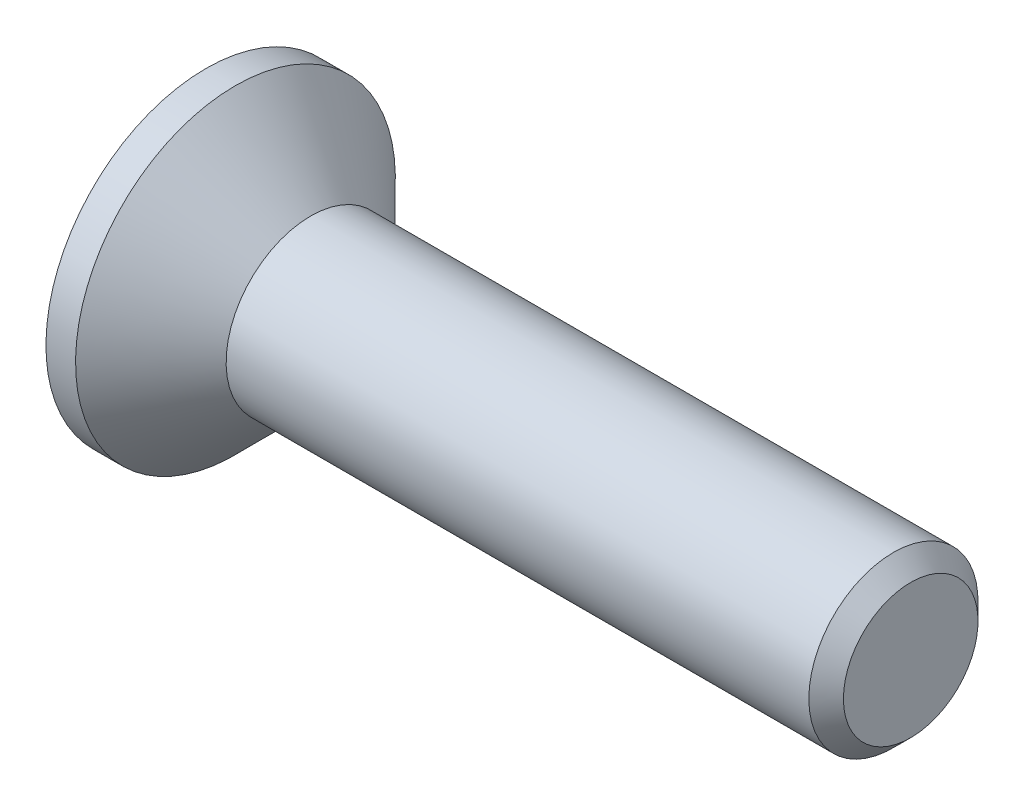
ISO-10303-21;
HEADER;
FILE_DESCRIPTION(('STEP AP214'),'2;1');
FILE_NAME('part.step','',(''),(''),'','','');
FILE_SCHEMA(('AUTOMOTIVE_DESIGN { 1 0 10303 214 1 1 1 1 }'));
ENDSEC;
DATA;
#1=APPLICATION_CONTEXT('core data for automotive mechanical design processes');
#2=APPLICATION_PROTOCOL_DEFINITION('international standard','automotive_design',2000,#1);
#3=PRODUCT_CONTEXT('',#1,'mechanical');
#4=PRODUCT('Part','Part','',(#3));
#5=PRODUCT_RELATED_PRODUCT_CATEGORY('part','',(#4));
#6=PRODUCT_DEFINITION_FORMATION('','',#4);
#7=PRODUCT_DEFINITION_CONTEXT('part definition',#1,'design');
#8=PRODUCT_DEFINITION('design','',#6,#7);
#9=PRODUCT_DEFINITION_SHAPE('','',#8);
#10=(LENGTH_UNIT() NAMED_UNIT(*) SI_UNIT(.MILLI.,.METRE.));
#11=(NAMED_UNIT(*) PLANE_ANGLE_UNIT() SI_UNIT($,.RADIAN.));
#12=(NAMED_UNIT(*) SI_UNIT($,.STERADIAN.) SOLID_ANGLE_UNIT());
#13=UNCERTAINTY_MEASURE_WITH_UNIT(LENGTH_MEASURE(1.E-05),#10,'distance_accuracy_value','');
#14=(GEOMETRIC_REPRESENTATION_CONTEXT(3) GLOBAL_UNCERTAINTY_ASSIGNED_CONTEXT((#13)) GLOBAL_UNIT_ASSIGNED_CONTEXT((#10,
#11,#12)) REPRESENTATION_CONTEXT('',''));
#15=CARTESIAN_POINT('',(0.,0.,0.));
#16=DIRECTION('',(0.,0.,1.));
#17=DIRECTION('',(1.,0.,0.));
#18=AXIS2_PLACEMENT_3D('',#15,#16,#17);
#19=CARTESIAN_POINT('',(2.66200000010031,0.,0.));
#20=DIRECTION('',(-1.,0.,0.));
#21=DIRECTION('',(0.,0.,1.));
#22=AXIS2_PLACEMENT_3D('',#19,#20,#21);
#23=CONICAL_SURFACE('',#22,2.32325748311268,1.04719755119511);
#24=CARTESIAN_POINT('',(4.00333333334402,-5.6843418860808E-11,0.));
#25=VERTEX_POINT('',#24);
#26=VERTEX_LOOP('',#25);
#27=FACE_BOUND('',#26,.T.);
#28=CARTESIAN_POINT('',(2.67000000003593,2.00000000000898,-1.15470053837406));
#29=CARTESIAN_POINT('',(2.69930445490963,1.91211211244576,-1.2054426339172));
#30=CARTESIAN_POINT('',(2.72595532293643,1.82346557788741,-1.25662273450719));
#31=CARTESIAN_POINT('',(2.7724736126371,1.64463765332212,-1.35986908489358));
#32=CARTESIAN_POINT('',(2.79232457969963,1.55445308692338,-1.41193716858064));
#33=CARTESIAN_POINT('',(2.8232240410923,1.37520156624872,-1.51542808229481));
#34=CARTESIAN_POINT('',(2.83447821244179,1.28616218439098,-1.56683499337885));
#35=CARTESIAN_POINT('',(2.84791083190881,1.107664679545,-1.66989057585135));
#36=CARTESIAN_POINT('',(2.85010040606531,1.0182072049015,-1.7215388729178));
#37=CARTESIAN_POINT('',(2.84553370988509,0.851065510295537,-1.81803817529137));
#38=CARTESIAN_POINT('',(2.83989871482364,0.773356209360144,-1.86290366110495));
#39=CARTESIAN_POINT('',(2.82204269932154,0.618443858236667,-1.95234234872689));
#40=CARTESIAN_POINT('',(2.80981558527079,0.541241343449125,-1.99691524142159));
#41=CARTESIAN_POINT('',(2.77925016670044,0.386009858272944,-2.08653818117477));
#42=CARTESIAN_POINT('',(2.76078235782,0.308000524612605,-2.13157689096287));
#43=CARTESIAN_POINT('',(2.71886823919787,0.153145029988656,-2.2209827524695));
#44=CARTESIAN_POINT('',(2.6954317712844,0.0762968866775444,-2.26535104869689));
#45=CARTESIAN_POINT('',(2.67000000003593,-8.98125042292854E-12,-2.30940107676369));
#46=B_SPLINE_CURVE_WITH_KNOTS('',3,(#28,#29,#30,#31,#32,#33,#34,#35,#36,#37,#38,#39,#40,#41,#42,
#43,#44,#45),.UNSPECIFIED.,.F.,.F.,(4,2,2,2,2,2,2,2,4),(0.,0.317016011557746,0.634793817028918,
0.944707606155502,1.25424088890116,1.52370778263971,1.79342419380671,2.06912162250575,
2.34427797353677),.UNSPECIFIED.);
#47=CARTESIAN_POINT('',(2.67000000003743,2.,-1.15470053838444));
#48=VERTEX_POINT('',#47);
#49=CARTESIAN_POINT('',(2.67000000003593,0.,-2.30940107676369));
#50=VERTEX_POINT('',#49);
#51=EDGE_CURVE('E81',#48,#50,#46,.T.);
#52=ORIENTED_EDGE('',*,*,#51,.T.);
#53=CARTESIAN_POINT('',(2.67000000003593,8.98222896558046E-12,-2.30940107676369));
#54=CARTESIAN_POINT('',(2.69930445490963,-0.0878878875542389,-2.25865898122055));
#55=CARTESIAN_POINT('',(2.72595532293643,-0.176534422112594,-2.20747888063056));
#56=CARTESIAN_POINT('',(2.7724736126371,-0.355362346677877,-2.10423253024417));
#57=CARTESIAN_POINT('',(2.79232457969963,-0.445546913076622,-2.05216444655711));
#58=CARTESIAN_POINT('',(2.8232240410923,-0.624798433751278,-1.94867353284294));
#59=CARTESIAN_POINT('',(2.83447821244179,-0.71383781560902,-1.8972666217589));
#60=CARTESIAN_POINT('',(2.84791083190881,-0.892335320454994,-1.7942110392864));
#61=CARTESIAN_POINT('',(2.85010040606531,-0.9817927950985,-1.74256274221995));
#62=CARTESIAN_POINT('',(2.84553370988509,-1.14893448970446,-1.64606343984638));
#63=CARTESIAN_POINT('',(2.83989871482364,-1.22664379063986,-1.6011979540328));
#64=CARTESIAN_POINT('',(2.82204269932154,-1.38155614176333,-1.51175926641086));
#65=CARTESIAN_POINT('',(2.80981558527079,-1.45875865655087,-1.46718637371616));
#66=CARTESIAN_POINT('',(2.77925016670044,-1.61399014172706,-1.37756343396298));
#67=CARTESIAN_POINT('',(2.76078235782,-1.69199947538739,-1.33252472417488));
#68=CARTESIAN_POINT('',(2.71886823919787,-1.84685497001134,-1.24311886266825));
#69=CARTESIAN_POINT('',(2.6954317712844,-1.92370311332246,-1.19875056644086));
#70=CARTESIAN_POINT('',(2.67000000003593,-2.00000000000898,-1.15470053837406));
#71=B_SPLINE_CURVE_WITH_KNOTS('',3,(#53,#54,#55,#56,#57,#58,#59,#60,#61,#62,#63,#64,#65,#66,#67,
#68,#69,#70),.UNSPECIFIED.,.F.,.F.,(4,2,2,2,2,2,2,2,4),(0.,0.317016011557746,0.634793817028918,
0.944707606155501,1.25424088890116,1.52370778263971,1.79342419380671,2.06912162250575,
2.34427797353677),.UNSPECIFIED.);
#72=CARTESIAN_POINT('',(2.67000000003593,-2.00000000000449,-1.15470053838184));
#73=VERTEX_POINT('',#72);
#74=EDGE_CURVE('E83',#50,#73,#71,.T.);
#75=ORIENTED_EDGE('',*,*,#74,.T.);
#76=CARTESIAN_POINT('',(2.67000000003593,-2.,-1.15470053838962));
#77=CARTESIAN_POINT('',(2.69930445490963,-2.,-1.05321634730335));
#78=CARTESIAN_POINT('',(2.72595532293643,-2.,-0.950856146123367));
#79=CARTESIAN_POINT('',(2.7724736126371,-2.,-0.744363445350591));
#80=CARTESIAN_POINT('',(2.79232457969963,-2.,-0.64022727797646));
#81=CARTESIAN_POINT('',(2.8232240410923,-2.,-0.433245450548134));
#82=CARTESIAN_POINT('',(2.83447821244179,-2.,-0.330431628380044));
#83=CARTESIAN_POINT('',(2.84791083190881,-2.,-0.124320463435045));
#84=CARTESIAN_POINT('',(2.85010040606531,-2.,-0.0210238693021399));
#85=CARTESIAN_POINT('',(2.84553370988509,-2.,0.171974735444984));
#86=CARTESIAN_POINT('',(2.83989871482364,-2.,0.261705707072158));
#87=CARTESIAN_POINT('',(2.82204269932153,-2.,0.440583082316032));
#88=CARTESIAN_POINT('',(2.80981558527079,-2.,0.529728867705438));
#89=CARTESIAN_POINT('',(2.77925016670044,-2.,0.708974747211785));
#90=CARTESIAN_POINT('',(2.76078235782,-2.,0.799052166787984));
#91=CARTESIAN_POINT('',(2.71886823919787,-2.,0.977863889801243));
#92=CARTESIAN_POINT('',(2.69543177128439,-2.,1.06660048225603));
#93=CARTESIAN_POINT('',(2.67000000003593,-2.,1.15470053838962));
#94=B_SPLINE_CURVE_WITH_KNOTS('',3,(#76,#77,#78,#79,#80,#81,#82,#83,#84,#85,#86,#87,#88,#89,#90,
#91,#92,#93),.UNSPECIFIED.,.F.,.F.,(4,2,2,2,2,2,2,2,4),(0.,0.317016011557746,0.634793817028918,
0.944707606155502,1.25424088890116,1.52370778263971,1.79342419380671,2.06912162250575,
2.34427797353677),.UNSPECIFIED.);
#95=CARTESIAN_POINT('',(2.67000000003593,-2.00000000000449,1.15470053838184));
#96=VERTEX_POINT('',#95);
#97=EDGE_CURVE('E104',#73,#96,#94,.T.);
#98=ORIENTED_EDGE('',*,*,#97,.T.);
#99=CARTESIAN_POINT('',(2.67000000003593,-2.00000000000898,1.15470053837406));
#100=CARTESIAN_POINT('',(2.69930445490963,-1.91211211244576,1.2054426339172));
#101=CARTESIAN_POINT('',(2.72595532293643,-1.82346557788741,1.25662273450719));
#102=CARTESIAN_POINT('',(2.7724736126371,-1.64463765332212,1.35986908489358));
#103=CARTESIAN_POINT('',(2.79232457969963,-1.55445308692338,1.41193716858064));
#104=CARTESIAN_POINT('',(2.8232240410923,-1.37520156624872,1.51542808229481));
#105=CARTESIAN_POINT('',(2.83447821244179,-1.28616218439098,1.56683499337885));
#106=CARTESIAN_POINT('',(2.84791083190881,-1.10766467954501,1.66989057585135));
#107=CARTESIAN_POINT('',(2.85010040606531,-1.0182072049015,1.7215388729178));
#108=CARTESIAN_POINT('',(2.84553370988509,-0.851065510295537,1.81803817529137));
#109=CARTESIAN_POINT('',(2.83989871482364,-0.773356209360144,1.86290366110495));
#110=CARTESIAN_POINT('',(2.82204269932154,-0.618443858236667,1.95234234872689));
#111=CARTESIAN_POINT('',(2.80981558527079,-0.541241343449126,1.99691524142159));
#112=CARTESIAN_POINT('',(2.77925016670044,-0.386009858272944,2.08653818117477));
#113=CARTESIAN_POINT('',(2.76078235782,-0.308000524612605,2.13157689096287));
#114=CARTESIAN_POINT('',(2.71886823919787,-0.153145029988656,2.2209827524695));
#115=CARTESIAN_POINT('',(2.6954317712844,-0.0762968866775448,2.26535104869689));
#116=CARTESIAN_POINT('',(2.67000000003593,8.98107207264259E-12,2.30940107676369));
#117=B_SPLINE_CURVE_WITH_KNOTS('',3,(#99,#100,#101,#102,#103,#104,#105,#106,#107,#108,#109,#110,
#111,#112,#113,#114,#115,#116),.UNSPECIFIED.,.F.,.F.,(4,2,2,2,2,2,2,2,4),(0.,0.317016011557746,
0.634793817028918,0.944707606155502,1.25424088890116,1.52370778263971,1.79342419380671,
2.06912162250575,2.34427797353677),.UNSPECIFIED.);
#118=CARTESIAN_POINT('',(2.67000000003593,0.,2.30940107676369));
#119=VERTEX_POINT('',#118);
#120=EDGE_CURVE('E109',#96,#119,#117,.T.);
#121=ORIENTED_EDGE('',*,*,#120,.T.);
#122=CARTESIAN_POINT('',(2.67000000003593,-8.98246402097027E-12,2.30940107676369));
#123=CARTESIAN_POINT('',(2.69930445490963,0.0878878875542385,2.25865898122055));
#124=CARTESIAN_POINT('',(2.72595532293643,0.176534422112593,2.20747888063056));
#125=CARTESIAN_POINT('',(2.7724736126371,0.355362346677876,2.10423253024417));
#126=CARTESIAN_POINT('',(2.79232457969963,0.445546913076621,2.0521644465571));
#127=CARTESIAN_POINT('',(2.8232240410923,0.624798433751278,1.94867353284294));
#128=CARTESIAN_POINT('',(2.83447821244179,0.71383781560902,1.8972666217589));
#129=CARTESIAN_POINT('',(2.84791083190882,0.892335320454993,1.7942110392864));
#130=CARTESIAN_POINT('',(2.85010040606532,0.981792795098499,1.74256274221994));
#131=CARTESIAN_POINT('',(2.84553370988509,1.14893448970446,1.64606343984638));
#132=CARTESIAN_POINT('',(2.83989871482365,1.22664379063985,1.60119795403279));
#133=CARTESIAN_POINT('',(2.82204269932154,1.38155614176333,1.51175926641086));
#134=CARTESIAN_POINT('',(2.8098155852708,1.45875865655087,1.46718637371615));
#135=CARTESIAN_POINT('',(2.77925016670044,1.61399014172706,1.37756343396298));
#136=CARTESIAN_POINT('',(2.76078235782,1.69199947538739,1.33252472417488));
#137=CARTESIAN_POINT('',(2.71886823919787,1.84685497001134,1.24311886266825));
#138=CARTESIAN_POINT('',(2.6954317712844,1.92370311332245,1.19875056644086));
#139=CARTESIAN_POINT('',(2.67000000003593,2.00000000000898,1.15470053837406));
#140=B_SPLINE_CURVE_WITH_KNOTS('',3,(#122,#123,#124,#125,#126,#127,#128,#129,#130,#131,#132,
#133,#134,#135,#136,#137,#138,#139),.UNSPECIFIED.,.F.,.F.,(4,2,2,2,2,2,2,2,4),(0.,
0.317016011557746,0.634793817028918,0.944707606155502,1.25424088890116,1.52370778263971,
1.79342419380672,2.06912162250575,2.34427797353678),.UNSPECIFIED.);
#141=CARTESIAN_POINT('',(2.67000000003593,2.00000000000449,1.15470053838184));
#142=VERTEX_POINT('',#141);
#143=EDGE_CURVE('E114',#119,#142,#140,.T.);
#144=ORIENTED_EDGE('',*,*,#143,.T.);
#145=CARTESIAN_POINT('',(2.67000000003593,2.,1.15470053838962));
#146=CARTESIAN_POINT('',(2.69930445490963,2.,1.05321634730335));
#147=CARTESIAN_POINT('',(2.72595532293643,2.,0.950856146123365));
#148=CARTESIAN_POINT('',(2.7724736126371,2.,0.744363445350589));
#149=CARTESIAN_POINT('',(2.79232457969963,2.,0.640227277976458));
#150=CARTESIAN_POINT('',(2.8232240410923,2.,0.433245450548133));
#151=CARTESIAN_POINT('',(2.83447821244179,2.,0.330431628380042));
#152=CARTESIAN_POINT('',(2.84791083190881,2.,0.124320463435043));
#153=CARTESIAN_POINT('',(2.85010040606531,2.,0.0210238693021387));
#154=CARTESIAN_POINT('',(2.84553370988509,2.,-0.171974735444985));
#155=CARTESIAN_POINT('',(2.83989871482364,2.,-0.261705707072159));
#156=CARTESIAN_POINT('',(2.82204269932153,2.,-0.440583082316033));
#157=CARTESIAN_POINT('',(2.80981558527079,2.,-0.529728867705439));
#158=CARTESIAN_POINT('',(2.77925016670044,2.,-0.708974747211786));
#159=CARTESIAN_POINT('',(2.76078235782,2.,-0.799052166787985));
#160=CARTESIAN_POINT('',(2.71886823919787,2.,-0.977863889801244));
#161=CARTESIAN_POINT('',(2.6954317712844,2.,-1.06660048225603));
#162=CARTESIAN_POINT('',(2.67000000003593,2.,-1.15470053838962));
#163=B_SPLINE_CURVE_WITH_KNOTS('',3,(#145,#146,#147,#148,#149,#150,#151,#152,#153,#154,#155,
#156,#157,#158,#159,#160,#161,#162),.UNSPECIFIED.,.F.,.F.,(4,2,2,2,2,2,2,2,4),(0.,
0.317016011557746,0.634793817028918,0.944707606155502,1.25424088890116,1.52370778263971,
1.79342419380671,2.06912162250574,2.34427797353677),.UNSPECIFIED.);
#164=EDGE_CURVE('E21',#142,#48,#163,.T.);
#165=ORIENTED_EDGE('',*,*,#164,.T.);
#166=EDGE_LOOP('',(#52,#75,#98,#121,#144,#165));
#167=FACE_BOUND('',#166,.T.);
#168=ADVANCED_FACE('F17',(#27,#167),#23,.F.);
#169=CARTESIAN_POINT('',(0.,2.,1.15470053837925));
#170=DIRECTION('',(0.,1.,0.));
#171=DIRECTION('',(0.,0.,1.));
#172=AXIS2_PLACEMENT_3D('',#169,#170,#171);
#173=PLANE('',#172);
#174=DIRECTION('',(1.,0.,0.));
#175=VECTOR('',#174,1.);
#176=CARTESIAN_POINT('',(0.,2.,1.15470053837925));
#177=LINE('',#176,#175);
#178=CARTESIAN_POINT('',(0.,2.,1.15470053837925));
#179=VERTEX_POINT('',#178);
#180=EDGE_CURVE('E117',#142,#179,#177,.F.);
#181=ORIENTED_EDGE('',*,*,#180,.T.);
#182=DIRECTION('',(0.,0.,1.));
#183=VECTOR('',#182,1.);
#184=CARTESIAN_POINT('',(0.,2.,0.));
#185=LINE('',#184,#183);
#186=CARTESIAN_POINT('',(0.,2.,-1.15470053837925));
#187=VERTEX_POINT('',#186);
#188=EDGE_CURVE('E87',#187,#179,#185,.T.);
#189=ORIENTED_EDGE('',*,*,#188,.F.);
#190=DIRECTION('',(1.,0.,0.));
#191=VECTOR('',#190,1.);
#192=CARTESIAN_POINT('',(0.,2.,-1.15470053837925));
#193=LINE('',#192,#191);
#194=EDGE_CURVE('E88',#187,#48,#193,.T.);
#195=ORIENTED_EDGE('',*,*,#194,.T.);
#196=ORIENTED_EDGE('',*,*,#164,.F.);
#197=EDGE_LOOP('',(#181,#189,#195,#196));
#198=FACE_BOUND('',#197,.T.);
#199=ADVANCED_FACE('F77',(#198),#173,.F.);
#200=CARTESIAN_POINT('',(0.,0.,2.3094010767585));
#201=DIRECTION('',(0.,0.500000000000001,0.866025403784438));
#202=DIRECTION('',(0.,-0.866025403784438,0.500000000000001));
#203=AXIS2_PLACEMENT_3D('',#200,#201,#202);
#204=PLANE('',#203);
#205=DIRECTION('',(1.,0.,0.));
#206=VECTOR('',#205,1.);
#207=CARTESIAN_POINT('',(0.,0.,2.3094010767585));
#208=LINE('',#207,#206);
#209=CARTESIAN_POINT('',(0.,0.,2.3094010767585));
#210=VERTEX_POINT('',#209);
#211=EDGE_CURVE('E112',#119,#210,#208,.F.);
#212=ORIENTED_EDGE('',*,*,#211,.T.);
#213=DIRECTION('',(0.,-0.866025403784439,0.499999999999999));
#214=VECTOR('',#213,1.);
#215=CARTESIAN_POINT('',(0.,2.,1.15470053837925));
#216=LINE('',#215,#214);
#217=EDGE_CURVE('E123',#179,#210,#216,.T.);
#218=ORIENTED_EDGE('',*,*,#217,.F.);
#219=ORIENTED_EDGE('',*,*,#180,.F.);
#220=ORIENTED_EDGE('',*,*,#143,.F.);
#221=EDGE_LOOP('',(#212,#218,#219,#220));
#222=FACE_BOUND('',#221,.T.);
#223=ADVANCED_FACE('F190',(#222),#204,.F.);
#224=CARTESIAN_POINT('',(0.,-2.,1.15470053837925));
#225=DIRECTION('',(0.,-0.5,0.866025403784439));
#226=DIRECTION('',(0.,-0.866025403784439,-0.5));
#227=AXIS2_PLACEMENT_3D('',#224,#225,#226);
#228=PLANE('',#227);
#229=DIRECTION('',(1.,0.,0.));
#230=VECTOR('',#229,1.);
#231=CARTESIAN_POINT('',(0.,-2.,1.15470053837925));
#232=LINE('',#231,#230);
#233=CARTESIAN_POINT('',(0.,-2.,1.15470053837925));
#234=VERTEX_POINT('',#233);
#235=EDGE_CURVE('E107',#96,#234,#232,.F.);
#236=ORIENTED_EDGE('',*,*,#235,.T.);
#237=DIRECTION('',(0.,-0.866025403784439,-0.499999999999999));
#238=VECTOR('',#237,1.);
#239=CARTESIAN_POINT('',(0.,0.,2.3094010767585));
#240=LINE('',#239,#238);
#241=EDGE_CURVE('E137',#210,#234,#240,.T.);
#242=ORIENTED_EDGE('',*,*,#241,.F.);
#243=ORIENTED_EDGE('',*,*,#211,.F.);
#244=ORIENTED_EDGE('',*,*,#120,.F.);
#245=EDGE_LOOP('',(#236,#242,#243,#244));
#246=FACE_BOUND('',#245,.T.);
#247=ADVANCED_FACE('F175',(#246),#228,.F.);
#248=CARTESIAN_POINT('',(0.,-2.,-1.15470053837925));
#249=DIRECTION('',(0.,-1.,0.));
#250=DIRECTION('',(0.,0.,-1.));
#251=AXIS2_PLACEMENT_3D('',#248,#249,#250);
#252=PLANE('',#251);
#253=DIRECTION('',(1.,0.,0.));
#254=VECTOR('',#253,1.);
#255=CARTESIAN_POINT('',(0.,-2.,-1.15470053837925));
#256=LINE('',#255,#254);
#257=CARTESIAN_POINT('',(0.,-2.,-1.15470053837925));
#258=VERTEX_POINT('',#257);
#259=EDGE_CURVE('E96',#73,#258,#256,.F.);
#260=ORIENTED_EDGE('',*,*,#259,.T.);
#261=DIRECTION('',(0.,0.,1.));
#262=VECTOR('',#261,1.);
#263=CARTESIAN_POINT('',(0.,-2.,0.));
#264=LINE('',#263,#262);
#265=EDGE_CURVE('E132',#234,#258,#264,.F.);
#266=ORIENTED_EDGE('',*,*,#265,.F.);
#267=ORIENTED_EDGE('',*,*,#235,.F.);
#268=ORIENTED_EDGE('',*,*,#97,.F.);
#269=EDGE_LOOP('',(#260,#266,#267,#268));
#270=FACE_BOUND('',#269,.T.);
#271=ADVANCED_FACE('F171',(#270),#252,.F.);
#272=CARTESIAN_POINT('',(0.,0.,-2.3094010767585));
#273=DIRECTION('',(0.,-0.5,-0.866025403784439));
#274=DIRECTION('',(0.,0.866025403784439,-0.5));
#275=AXIS2_PLACEMENT_3D('',#272,#273,#274);
#276=PLANE('',#275);
#277=DIRECTION('',(1.,0.,0.));
#278=VECTOR('',#277,1.);
#279=CARTESIAN_POINT('',(0.,0.,-2.3094010767585));
#280=LINE('',#279,#278);
#281=CARTESIAN_POINT('',(0.,0.,-2.3094010767585));
#282=VERTEX_POINT('',#281);
#283=EDGE_CURVE('E39',#50,#282,#280,.F.);
#284=ORIENTED_EDGE('',*,*,#283,.T.);
#285=DIRECTION('',(0.,0.866025403784439,-0.499999999999999));
#286=VECTOR('',#285,1.);
#287=CARTESIAN_POINT('',(0.,-2.,-1.15470053837925));
#288=LINE('',#287,#286);
#289=EDGE_CURVE('E128',#258,#282,#288,.T.);
#290=ORIENTED_EDGE('',*,*,#289,.F.);
#291=ORIENTED_EDGE('',*,*,#259,.F.);
#292=ORIENTED_EDGE('',*,*,#74,.F.);
#293=EDGE_LOOP('',(#284,#290,#291,#292));
#294=FACE_BOUND('',#293,.T.);
#295=ADVANCED_FACE('F166',(#294),#276,.F.);
#296=CARTESIAN_POINT('',(0.,2.,-1.15470053837925));
#297=DIRECTION('',(0.,0.5,-0.866025403784439));
#298=DIRECTION('',(0.,0.866025403784439,0.5));
#299=AXIS2_PLACEMENT_3D('',#296,#297,#298);
#300=PLANE('',#299);
#301=ORIENTED_EDGE('',*,*,#194,.F.);
#302=DIRECTION('',(0.,0.866025403784439,0.499999999999999));
#303=VECTOR('',#302,1.);
#304=CARTESIAN_POINT('',(0.,0.,-2.3094010767585));
#305=LINE('',#304,#303);
#306=EDGE_CURVE('E92',#282,#187,#305,.T.);
#307=ORIENTED_EDGE('',*,*,#306,.F.);
#308=ORIENTED_EDGE('',*,*,#283,.F.);
#309=ORIENTED_EDGE('',*,*,#51,.F.);
#310=EDGE_LOOP('',(#301,#307,#308,#309));
#311=FACE_BOUND('',#310,.T.);
#312=ADVANCED_FACE('F90',(#311),#300,.F.);
#313=CARTESIAN_POINT('',(0.,3.98970053837926,0.));
#314=DIRECTION('',(-1.,0.,0.));
#315=DIRECTION('',(0.,-1.,0.));
#316=AXIS2_PLACEMENT_3D('',#313,#314,#315);
#317=PLANE('',#316);
#318=ORIENTED_EDGE('',*,*,#289,.T.);
#319=ORIENTED_EDGE('',*,*,#306,.T.);
#320=ORIENTED_EDGE('',*,*,#188,.T.);
#321=ORIENTED_EDGE('',*,*,#217,.T.);
#322=ORIENTED_EDGE('',*,*,#241,.T.);
#323=ORIENTED_EDGE('',*,*,#265,.T.);
#324=EDGE_LOOP('',(#318,#319,#320,#321,#322,#323));
#325=FACE_BOUND('',#324,.T.);
#326=CARTESIAN_POINT('',(0.,0.,0.));
#327=DIRECTION('',(1.,0.,0.));
#328=DIRECTION('',(0.,1.,0.));
#329=AXIS2_PLACEMENT_3D('',#326,#327,#328);
#330=CIRCLE('',#329,5.67000000000001);
#331=CARTESIAN_POINT('',(0.,5.67000000000001,0.));
#332=VERTEX_POINT('',#331);
#333=EDGE_CURVE('E127',#332,#332,#330,.T.);
#334=ORIENTED_EDGE('',*,*,#333,.F.);
#335=EDGE_LOOP('',(#334));
#336=FACE_BOUND('',#335,.T.);
#337=ADVANCED_FACE('F165',(#325,#336),#317,.T.);
#338=CARTESIAN_POINT('',(0.524999999999989,0.,0.));
#339=DIRECTION('',(1.,0.,0.));
#340=DIRECTION('',(0.,1.,0.));
#341=AXIS2_PLACEMENT_3D('',#338,#339,#340);
#342=CYLINDRICAL_SURFACE('',#341,5.67000000000001);
#343=ORIENTED_EDGE('',*,*,#333,.T.);
#344=EDGE_LOOP('',(#343));
#345=FACE_BOUND('',#344,.T.);
#346=CARTESIAN_POINT('',(1.05000000002065,0.,0.));
#347=DIRECTION('',(-1.,0.,0.));
#348=DIRECTION('',(0.,1.,0.));
#349=AXIS2_PLACEMENT_3D('',#346,#347,#348);
#350=CIRCLE('',#349,5.66999999995232);
#351=CARTESIAN_POINT('',(1.05000000002065,5.66999999995232,0.));
#352=VERTEX_POINT('',#351);
#353=EDGE_CURVE('E151',#352,#352,#350,.F.);
#354=ORIENTED_EDGE('',*,*,#353,.F.);
#355=EDGE_LOOP('',(#354));
#356=FACE_BOUND('',#355,.T.);
#357=ADVANCED_FACE('F217',(#345,#356),#342,.T.);
#358=CARTESIAN_POINT('',(25.,1.5,0.));
#359=DIRECTION('',(1.,0.,0.));
#360=DIRECTION('',(0.,1.,0.));
#361=AXIS2_PLACEMENT_3D('',#358,#359,#360);
#362=PLANE('',#361);
#363=CARTESIAN_POINT('',(25.0000000000341,0.,0.));
#364=DIRECTION('',(-1.,0.,0.));
#365=DIRECTION('',(0.,0.,1.));
#366=AXIS2_PLACEMENT_3D('',#363,#364,#365);
#367=CIRCLE('',#366,2.38654999998289);
#368=CARTESIAN_POINT('',(25.0000000000341,0.,2.38654999998289));
#369=VERTEX_POINT('',#368);
#370=EDGE_CURVE('E148',#369,#369,#367,.T.);
#371=ORIENTED_EDGE('',*,*,#370,.F.);
#372=EDGE_LOOP('',(#371));
#373=FACE_BOUND('',#372,.T.);
#374=ADVANCED_FACE('F214',(#373),#362,.T.);
#375=CARTESIAN_POINT('',(1.0499999999638,0.,0.));
#376=DIRECTION('',(-1.,0.,0.));
#377=DIRECTION('',(0.,0.,1.));
#378=AXIS2_PLACEMENT_3D('',#375,#376,#377);
#379=CONICAL_SURFACE('',#378,5.67000000006601,0.785398163397448);
#380=ORIENTED_EDGE('',*,*,#353,.T.);
#381=EDGE_LOOP('',(#380));
#382=FACE_BOUND('',#381,.T.);
#383=CARTESIAN_POINT('',(3.71999999999999,0.,0.));
#384=DIRECTION('',(1.,0.,0.));
#385=DIRECTION('',(0.,1.,0.));
#386=AXIS2_PLACEMENT_3D('',#383,#384,#385);
#387=CIRCLE('',#386,2.99999999999999);
#388=CARTESIAN_POINT('',(3.71999999999999,2.99999999999999,0.));
#389=VERTEX_POINT('',#388);
#390=EDGE_CURVE('E30',#389,#389,#387,.T.);
#391=ORIENTED_EDGE('',*,*,#390,.F.);
#392=EDGE_LOOP('',(#391));
#393=FACE_BOUND('',#392,.T.);
#394=ADVANCED_FACE('F207',(#382,#393),#379,.T.);
#395=CARTESIAN_POINT('',(24.3865500000311,0.,0.));
#396=DIRECTION('',(-1.,0.,0.));
#397=DIRECTION('',(0.,0.,1.));
#398=AXIS2_PLACEMENT_3D('',#395,#396,#397);
#399=CONICAL_SURFACE('',#398,2.9999999999859,0.785398163397448);
#400=ORIENTED_EDGE('',*,*,#370,.T.);
#401=EDGE_LOOP('',(#400));
#402=FACE_BOUND('',#401,.T.);
#403=CARTESIAN_POINT('',(24.38655,0.,0.));
#404=DIRECTION('',(1.,0.,0.));
#405=DIRECTION('',(0.,1.,0.));
#406=AXIS2_PLACEMENT_3D('',#403,#404,#405);
#407=CIRCLE('',#406,2.99999999999999);
#408=CARTESIAN_POINT('',(24.38655,2.99999999999999,0.));
#409=VERTEX_POINT('',#408);
#410=EDGE_CURVE('E11',#409,#409,#407,.F.);
#411=ORIENTED_EDGE('',*,*,#410,.F.);
#412=EDGE_LOOP('',(#411));
#413=FACE_BOUND('',#412,.T.);
#414=ADVANCED_FACE('F201',(#402,#413),#399,.T.);
#415=CARTESIAN_POINT('',(16.,0.,0.));
#416=DIRECTION('',(1.,0.,0.));
#417=DIRECTION('',(0.,1.,0.));
#418=AXIS2_PLACEMENT_3D('',#415,#416,#417);
#419=CYLINDRICAL_SURFACE('',#418,2.99999999999999);
#420=ORIENTED_EDGE('',*,*,#410,.T.);
#421=EDGE_LOOP('',(#420));
#422=FACE_BOUND('',#421,.T.);
#423=ORIENTED_EDGE('',*,*,#390,.T.);
#424=EDGE_LOOP('',(#423));
#425=FACE_BOUND('',#424,.T.);
#426=ADVANCED_FACE('F199',(#422,#425),#419,.T.);
#427=CLOSED_SHELL('',(#168,#199,#223,#247,#271,#295,#312,#337,#357,#374,#394,#414,#426));
#428=MANIFOLD_SOLID_BREP('B1',#427);
#429=ADVANCED_BREP_SHAPE_REPRESENTATION('',(#18,#428),#14);
#430=SHAPE_DEFINITION_REPRESENTATION(#9,#429);
ENDSEC;
END-ISO-10303-21;
